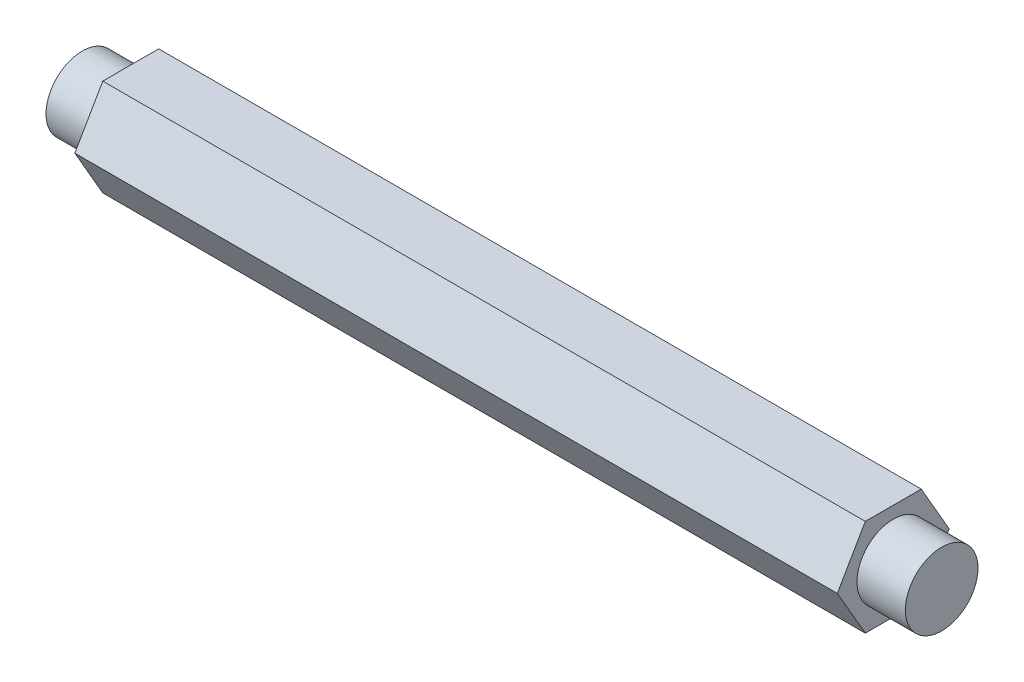
ISO-10303-21;
HEADER;
FILE_DESCRIPTION(('STEP AP214'),'2;1');
FILE_NAME('part.step','',(''),(''),'','','');
FILE_SCHEMA(('AUTOMOTIVE_DESIGN { 1 0 10303 214 1 1 1 1 }'));
ENDSEC;
DATA;
#1=APPLICATION_CONTEXT('core data for automotive mechanical design processes');
#2=APPLICATION_PROTOCOL_DEFINITION('international standard','automotive_design',2000,#1);
#3=PRODUCT_CONTEXT('',#1,'mechanical');
#4=PRODUCT('Part','Part','',(#3));
#5=PRODUCT_RELATED_PRODUCT_CATEGORY('part','',(#4));
#6=PRODUCT_DEFINITION_FORMATION('','',#4);
#7=PRODUCT_DEFINITION_CONTEXT('part definition',#1,'design');
#8=PRODUCT_DEFINITION('design','',#6,#7);
#9=PRODUCT_DEFINITION_SHAPE('','',#8);
#10=(LENGTH_UNIT() NAMED_UNIT(*) SI_UNIT(.MILLI.,.METRE.));
#11=(NAMED_UNIT(*) PLANE_ANGLE_UNIT() SI_UNIT($,.RADIAN.));
#12=(NAMED_UNIT(*) SI_UNIT($,.STERADIAN.) SOLID_ANGLE_UNIT());
#13=UNCERTAINTY_MEASURE_WITH_UNIT(LENGTH_MEASURE(1.E-05),#10,'distance_accuracy_value','');
#14=(GEOMETRIC_REPRESENTATION_CONTEXT(3) GLOBAL_UNCERTAINTY_ASSIGNED_CONTEXT((#13)) GLOBAL_UNIT_ASSIGNED_CONTEXT((#10,
#11,#12)) REPRESENTATION_CONTEXT('',''));
#15=CARTESIAN_POINT('',(0.,0.,0.));
#16=DIRECTION('',(0.,0.,1.));
#17=DIRECTION('',(1.,0.,0.));
#18=AXIS2_PLACEMENT_3D('',#15,#16,#17);
#19=CARTESIAN_POINT('',(112.7,-6.34999999999996,-3.6661742093542));
#20=DIRECTION('',(0.,0.499999999999995,0.866025403784441));
#21=DIRECTION('',(0.,-0.866025403784442,0.499999999999995));
#22=AXIS2_PLACEMENT_3D('',#19,#20,#21);
#23=PLANE('',#22);
#24=DIRECTION('',(0.,-0.866025403784442,0.499999999999995));
#25=VECTOR('',#24,1.);
#26=CARTESIAN_POINT('',(6.34999999999999,-6.34999999999996,-3.6661742093542));
#27=LINE('',#26,#25);
#28=CARTESIAN_POINT('',(6.35,0.,-7.33234841870825));
#29=VERTEX_POINT('',#28);
#30=CARTESIAN_POINT('',(6.35000000000002,-6.34999999999996,-3.6661742093542));
#31=VERTEX_POINT('',#30);
#32=EDGE_CURVE('E52',#29,#31,#27,.T.);
#33=ORIENTED_EDGE('',*,*,#32,.F.);
#34=DIRECTION('',(-1.,0.,0.));
#35=VECTOR('',#34,1.);
#36=CARTESIAN_POINT('',(112.7,0.,-7.33234841870825));
#37=LINE('',#36,#35);
#38=CARTESIAN_POINT('',(106.35,0.,-7.33234841870825));
#39=VERTEX_POINT('',#38);
#40=EDGE_CURVE('E120',#39,#29,#37,.T.);
#41=ORIENTED_EDGE('',*,*,#40,.F.);
#42=DIRECTION('',(0.,0.866025403784442,-0.499999999999995));
#43=VECTOR('',#42,1.);
#44=CARTESIAN_POINT('',(106.35,-6.34999999999996,-3.6661742093542));
#45=LINE('',#44,#43);
#46=CARTESIAN_POINT('',(106.35,-6.34999999999996,-3.6661742093542));
#47=VERTEX_POINT('',#46);
#48=EDGE_CURVE('E124',#47,#39,#45,.T.);
#49=ORIENTED_EDGE('',*,*,#48,.F.);
#50=DIRECTION('',(-1.,0.,0.));
#51=VECTOR('',#50,1.);
#52=CARTESIAN_POINT('',(112.7,-6.34999999999996,-3.6661742093542));
#53=LINE('',#52,#51);
#54=EDGE_CURVE('E114',#47,#31,#53,.T.);
#55=ORIENTED_EDGE('',*,*,#54,.T.);
#56=EDGE_LOOP('',(#33,#41,#49,#55));
#57=FACE_BOUND('',#56,.T.);
#58=ADVANCED_FACE('F39',(#57),#23,.F.);
#59=CARTESIAN_POINT('',(112.7,0.,-7.33234841870825));
#60=DIRECTION('',(0.,-0.500000000000001,0.866025403784438));
#61=DIRECTION('',(0.,-0.866025403784438,-0.500000000000001));
#62=AXIS2_PLACEMENT_3D('',#59,#60,#61);
#63=PLANE('',#62);
#64=DIRECTION('',(0.,-0.866025403784438,-0.500000000000001));
#65=VECTOR('',#64,1.);
#66=CARTESIAN_POINT('',(6.34999999999999,0.,-7.33234841870825));
#67=LINE('',#66,#65);
#68=CARTESIAN_POINT('',(6.35,6.35000000000001,-3.66617420935412));
#69=VERTEX_POINT('',#68);
#70=EDGE_CURVE('E148',#69,#29,#67,.T.);
#71=ORIENTED_EDGE('',*,*,#70,.F.);
#72=DIRECTION('',(-1.,0.,0.));
#73=VECTOR('',#72,1.);
#74=CARTESIAN_POINT('',(112.7,6.35000000000001,-3.66617420935411));
#75=LINE('',#74,#73);
#76=CARTESIAN_POINT('',(106.35,6.35000000000001,-3.66617420935411));
#77=VERTEX_POINT('',#76);
#78=EDGE_CURVE('E112',#77,#69,#75,.T.);
#79=ORIENTED_EDGE('',*,*,#78,.F.);
#80=DIRECTION('',(0.,0.866025403784438,0.500000000000001));
#81=VECTOR('',#80,1.);
#82=CARTESIAN_POINT('',(106.35,0.,-7.33234841870825));
#83=LINE('',#82,#81);
#84=EDGE_CURVE('E131',#39,#77,#83,.T.);
#85=ORIENTED_EDGE('',*,*,#84,.F.);
#86=ORIENTED_EDGE('',*,*,#40,.T.);
#87=EDGE_LOOP('',(#71,#79,#85,#86));
#88=FACE_BOUND('',#87,.T.);
#89=ADVANCED_FACE('F175',(#88),#63,.F.);
#90=CARTESIAN_POINT('',(112.7,6.35000000000001,-3.66617420935411));
#91=DIRECTION('',(0.,-1.,0.));
#92=DIRECTION('',(0.,0.,-1.));
#93=AXIS2_PLACEMENT_3D('',#90,#91,#92);
#94=PLANE('',#93);
#95=DIRECTION('',(0.,0.,-1.));
#96=VECTOR('',#95,1.);
#97=CARTESIAN_POINT('',(6.34999999999999,6.35000000000001,-3.66617420935411));
#98=LINE('',#97,#96);
#99=CARTESIAN_POINT('',(6.35,6.34999999999999,3.66617420935416));
#100=VERTEX_POINT('',#99);
#101=EDGE_CURVE('E107',#100,#69,#98,.T.);
#102=ORIENTED_EDGE('',*,*,#101,.F.);
#103=DIRECTION('',(-1.,0.,0.));
#104=VECTOR('',#103,1.);
#105=CARTESIAN_POINT('',(112.7,6.34999999999999,3.66617420935416));
#106=LINE('',#105,#104);
#107=CARTESIAN_POINT('',(106.35,6.34999999999999,3.66617420935416));
#108=VERTEX_POINT('',#107);
#109=EDGE_CURVE('E106',#108,#100,#106,.T.);
#110=ORIENTED_EDGE('',*,*,#109,.F.);
#111=DIRECTION('',(0.,0.,1.));
#112=VECTOR('',#111,1.);
#113=CARTESIAN_POINT('',(106.35,6.35000000000001,-3.66617420935411));
#114=LINE('',#113,#112);
#115=EDGE_CURVE('E136',#77,#108,#114,.T.);
#116=ORIENTED_EDGE('',*,*,#115,.F.);
#117=ORIENTED_EDGE('',*,*,#78,.T.);
#118=EDGE_LOOP('',(#102,#110,#116,#117));
#119=FACE_BOUND('',#118,.T.);
#120=ADVANCED_FACE('F179',(#119),#94,.F.);
#121=CARTESIAN_POINT('',(112.7,6.34999999999999,3.66617420935416));
#122=DIRECTION('',(0.,-0.499999999999995,-0.866025403784441));
#123=DIRECTION('',(0.,0.866025403784442,-0.499999999999995));
#124=AXIS2_PLACEMENT_3D('',#121,#122,#123);
#125=PLANE('',#124);
#126=DIRECTION('',(0.,0.866025403784442,-0.499999999999995));
#127=VECTOR('',#126,1.);
#128=CARTESIAN_POINT('',(6.34999999999999,6.34999999999999,3.66617420935416));
#129=LINE('',#128,#127);
#130=CARTESIAN_POINT('',(6.35,0.,7.33234841870825));
#131=VERTEX_POINT('',#130);
#132=EDGE_CURVE('E91',#131,#100,#129,.T.);
#133=ORIENTED_EDGE('',*,*,#132,.F.);
#134=DIRECTION('',(-1.,0.,0.));
#135=VECTOR('',#134,1.);
#136=CARTESIAN_POINT('',(112.7,0.,7.33234841870825));
#137=LINE('',#136,#135);
#138=CARTESIAN_POINT('',(106.35,0.,7.33234841870825));
#139=VERTEX_POINT('',#138);
#140=EDGE_CURVE('E104',#139,#131,#137,.T.);
#141=ORIENTED_EDGE('',*,*,#140,.F.);
#142=DIRECTION('',(0.,-0.866025403784442,0.499999999999995));
#143=VECTOR('',#142,1.);
#144=CARTESIAN_POINT('',(106.35,6.34999999999999,3.66617420935416));
#145=LINE('',#144,#143);
#146=EDGE_CURVE('E138',#108,#139,#145,.T.);
#147=ORIENTED_EDGE('',*,*,#146,.F.);
#148=ORIENTED_EDGE('',*,*,#109,.T.);
#149=EDGE_LOOP('',(#133,#141,#147,#148));
#150=FACE_BOUND('',#149,.T.);
#151=ADVANCED_FACE('F102',(#150),#125,.F.);
#152=CARTESIAN_POINT('',(112.7,0.,7.33234841870825));
#153=DIRECTION('',(0.,0.500000000000007,-0.866025403784434));
#154=DIRECTION('',(0.,0.866025403784435,0.500000000000007));
#155=AXIS2_PLACEMENT_3D('',#152,#153,#154);
#156=PLANE('',#155);
#157=DIRECTION('',(0.,0.866025403784435,0.500000000000007));
#158=VECTOR('',#157,1.);
#159=CARTESIAN_POINT('',(6.34999999999999,0.,7.33234841870825));
#160=LINE('',#159,#158);
#161=CARTESIAN_POINT('',(6.35,-6.35000000000004,3.66617420935407));
#162=VERTEX_POINT('',#161);
#163=EDGE_CURVE('E88',#162,#131,#160,.T.);
#164=ORIENTED_EDGE('',*,*,#163,.F.);
#165=DIRECTION('',(-1.,0.,0.));
#166=VECTOR('',#165,1.);
#167=CARTESIAN_POINT('',(112.7,-6.35000000000004,3.66617420935407));
#168=LINE('',#167,#166);
#169=CARTESIAN_POINT('',(106.35,-6.35000000000004,3.66617420935407));
#170=VERTEX_POINT('',#169);
#171=EDGE_CURVE('E110',#170,#162,#168,.T.);
#172=ORIENTED_EDGE('',*,*,#171,.F.);
#173=DIRECTION('',(0.,-0.866025403784435,-0.500000000000007));
#174=VECTOR('',#173,1.);
#175=CARTESIAN_POINT('',(106.35,0.,7.33234841870825));
#176=LINE('',#175,#174);
#177=EDGE_CURVE('E60',#139,#170,#176,.T.);
#178=ORIENTED_EDGE('',*,*,#177,.F.);
#179=ORIENTED_EDGE('',*,*,#140,.T.);
#180=EDGE_LOOP('',(#164,#172,#178,#179));
#181=FACE_BOUND('',#180,.T.);
#182=ADVANCED_FACE('F109',(#181),#156,.F.);
#183=CARTESIAN_POINT('',(112.7,-6.35000000000004,3.66617420935407));
#184=DIRECTION('',(0.,1.,0.));
#185=DIRECTION('',(0.,0.,1.));
#186=AXIS2_PLACEMENT_3D('',#183,#184,#185);
#187=PLANE('',#186);
#188=DIRECTION('',(0.,0.,1.));
#189=VECTOR('',#188,1.);
#190=CARTESIAN_POINT('',(6.34999999999999,-6.35000000000004,3.66617420935407));
#191=LINE('',#190,#189);
#192=EDGE_CURVE('E11',#31,#162,#191,.T.);
#193=ORIENTED_EDGE('',*,*,#192,.F.);
#194=ORIENTED_EDGE('',*,*,#54,.F.);
#195=DIRECTION('',(0.,0.,-1.));
#196=VECTOR('',#195,1.);
#197=CARTESIAN_POINT('',(106.35,-6.35000000000004,3.66617420935407));
#198=LINE('',#197,#196);
#199=EDGE_CURVE('E46',#170,#47,#198,.T.);
#200=ORIENTED_EDGE('',*,*,#199,.F.);
#201=ORIENTED_EDGE('',*,*,#171,.T.);
#202=EDGE_LOOP('',(#193,#194,#200,#201));
#203=FACE_BOUND('',#202,.T.);
#204=ADVANCED_FACE('F133',(#203),#187,.F.);
#205=CARTESIAN_POINT('',(106.35,0.,0.));
#206=DIRECTION('',(1.,0.,0.));
#207=DIRECTION('',(0.,0.,-1.));
#208=AXIS2_PLACEMENT_3D('',#205,#206,#207);
#209=PLANE('',#208);
#210=CARTESIAN_POINT('',(106.35,0.,0.));
#211=DIRECTION('',(1.,0.,0.));
#212=DIRECTION('',(0.,0.,-1.));
#213=AXIS2_PLACEMENT_3D('',#210,#211,#212);
#214=CIRCLE('',#213,4.7625);
#215=CARTESIAN_POINT('',(106.35,0.,-4.7625));
#216=VERTEX_POINT('',#215);
#217=EDGE_CURVE('E141',#216,#216,#214,.T.);
#218=ORIENTED_EDGE('',*,*,#217,.F.);
#219=EDGE_LOOP('',(#218));
#220=FACE_BOUND('',#219,.T.);
#221=ORIENTED_EDGE('',*,*,#48,.T.);
#222=ORIENTED_EDGE('',*,*,#84,.T.);
#223=ORIENTED_EDGE('',*,*,#115,.T.);
#224=ORIENTED_EDGE('',*,*,#146,.T.);
#225=ORIENTED_EDGE('',*,*,#177,.T.);
#226=ORIENTED_EDGE('',*,*,#199,.T.);
#227=EDGE_LOOP('',(#221,#222,#223,#224,#225,#226));
#228=FACE_BOUND('',#227,.T.);
#229=ADVANCED_FACE('F123',(#220,#228),#209,.T.);
#230=CARTESIAN_POINT('',(106.35,0.,0.));
#231=DIRECTION('',(1.,0.,0.));
#232=DIRECTION('',(0.,0.,-1.));
#233=AXIS2_PLACEMENT_3D('',#230,#231,#232);
#234=CYLINDRICAL_SURFACE('',#233,4.7625);
#235=ORIENTED_EDGE('',*,*,#217,.T.);
#236=EDGE_LOOP('',(#235));
#237=FACE_BOUND('',#236,.T.);
#238=CARTESIAN_POINT('',(112.7,0.,0.));
#239=DIRECTION('',(1.,0.,0.));
#240=DIRECTION('',(0.,0.,-1.));
#241=AXIS2_PLACEMENT_3D('',#238,#239,#240);
#242=CIRCLE('',#241,4.7625);
#243=CARTESIAN_POINT('',(112.7,0.,-4.7625));
#244=VERTEX_POINT('',#243);
#245=EDGE_CURVE('E142',#244,#244,#242,.T.);
#246=ORIENTED_EDGE('',*,*,#245,.F.);
#247=EDGE_LOOP('',(#246));
#248=FACE_BOUND('',#247,.T.);
#249=ADVANCED_FACE('F170',(#237,#248),#234,.T.);
#250=CARTESIAN_POINT('',(112.7,0.,0.));
#251=DIRECTION('',(1.,0.,0.));
#252=DIRECTION('',(0.,0.,-1.));
#253=AXIS2_PLACEMENT_3D('',#250,#251,#252);
#254=PLANE('',#253);
#255=ORIENTED_EDGE('',*,*,#245,.T.);
#256=EDGE_LOOP('',(#255));
#257=FACE_BOUND('',#256,.T.);
#258=ADVANCED_FACE('F161',(#257),#254,.T.);
#259=CARTESIAN_POINT('',(6.35,0.,0.));
#260=DIRECTION('',(-1.,0.,0.));
#261=DIRECTION('',(0.,0.,1.));
#262=AXIS2_PLACEMENT_3D('',#259,#260,#261);
#263=PLANE('',#262);
#264=CARTESIAN_POINT('',(6.35,0.,0.));
#265=DIRECTION('',(-1.,0.,0.));
#266=DIRECTION('',(0.,0.,1.));
#267=AXIS2_PLACEMENT_3D('',#264,#265,#266);
#268=CIRCLE('',#267,4.7625);
#269=CARTESIAN_POINT('',(6.35,0.,4.7625));
#270=VERTEX_POINT('',#269);
#271=EDGE_CURVE('E97',#270,#270,#268,.T.);
#272=ORIENTED_EDGE('',*,*,#271,.F.);
#273=EDGE_LOOP('',(#272));
#274=FACE_BOUND('',#273,.T.);
#275=ORIENTED_EDGE('',*,*,#32,.T.);
#276=ORIENTED_EDGE('',*,*,#192,.T.);
#277=ORIENTED_EDGE('',*,*,#163,.T.);
#278=ORIENTED_EDGE('',*,*,#132,.T.);
#279=ORIENTED_EDGE('',*,*,#101,.T.);
#280=ORIENTED_EDGE('',*,*,#70,.T.);
#281=EDGE_LOOP('',(#275,#276,#277,#278,#279,#280));
#282=FACE_BOUND('',#281,.T.);
#283=ADVANCED_FACE('F90',(#274,#282),#263,.T.);
#284=CARTESIAN_POINT('',(6.35,0.,0.));
#285=DIRECTION('',(-1.,0.,0.));
#286=DIRECTION('',(0.,0.,1.));
#287=AXIS2_PLACEMENT_3D('',#284,#285,#286);
#288=CYLINDRICAL_SURFACE('',#287,4.7625);
#289=ORIENTED_EDGE('',*,*,#271,.T.);
#290=EDGE_LOOP('',(#289));
#291=FACE_BOUND('',#290,.T.);
#292=CARTESIAN_POINT('',(0.,0.,0.));
#293=DIRECTION('',(-1.,0.,0.));
#294=DIRECTION('',(0.,0.,1.));
#295=AXIS2_PLACEMENT_3D('',#292,#293,#294);
#296=CIRCLE('',#295,4.7625);
#297=CARTESIAN_POINT('',(0.,0.,4.7625));
#298=VERTEX_POINT('',#297);
#299=EDGE_CURVE('E151',#298,#298,#296,.T.);
#300=ORIENTED_EDGE('',*,*,#299,.F.);
#301=EDGE_LOOP('',(#300));
#302=FACE_BOUND('',#301,.T.);
#303=ADVANCED_FACE('F157',(#291,#302),#288,.T.);
#304=CARTESIAN_POINT('',(0.,0.,0.));
#305=DIRECTION('',(1.,0.,0.));
#306=DIRECTION('',(0.,0.,-1.));
#307=AXIS2_PLACEMENT_3D('',#304,#305,#306);
#308=PLANE('',#307);
#309=ORIENTED_EDGE('',*,*,#299,.T.);
#310=EDGE_LOOP('',(#309));
#311=FACE_BOUND('',#310,.T.);
#312=ADVANCED_FACE('F167',(#311),#308,.F.);
#313=CLOSED_SHELL('',(#58,#89,#120,#151,#182,#204,#229,#249,#258,#283,#303,#312));
#314=MANIFOLD_SOLID_BREP('B2',#313);
#315=ADVANCED_BREP_SHAPE_REPRESENTATION('',(#18,#314),#14);
#316=SHAPE_DEFINITION_REPRESENTATION(#9,#315);
ENDSEC;
END-ISO-10303-21;
